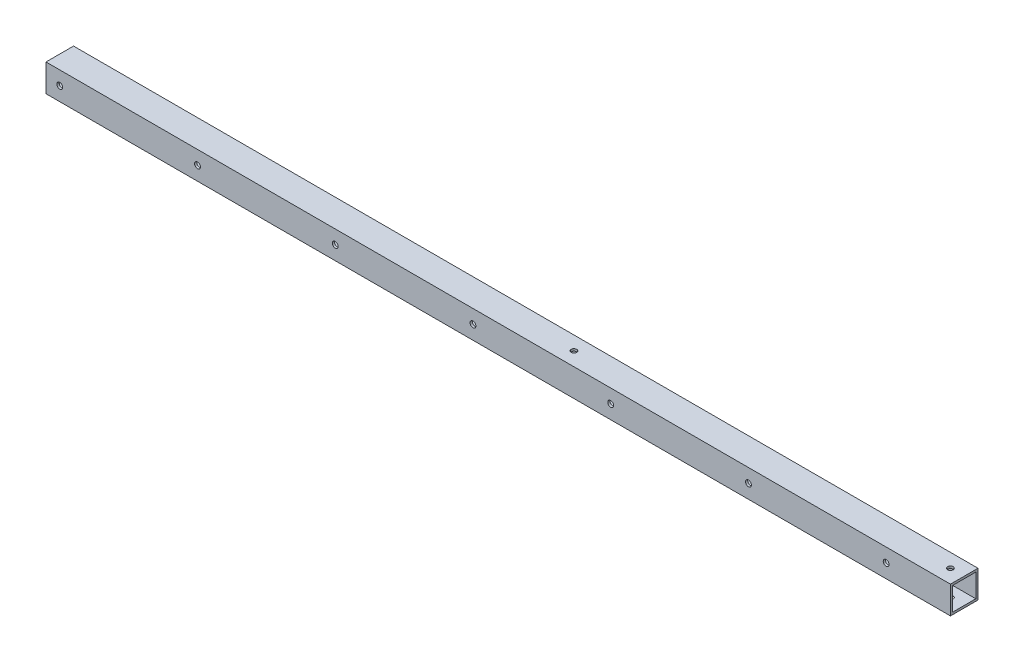
ISO-10303-21;
HEADER;
FILE_DESCRIPTION(('STEP AP214'),'2;1');
FILE_NAME('part.step','',(''),(''),'','','');
FILE_SCHEMA(('AUTOMOTIVE_DESIGN { 1 0 10303 214 1 1 1 1 }'));
ENDSEC;
DATA;
#1=APPLICATION_CONTEXT('core data for automotive mechanical design processes');
#2=APPLICATION_PROTOCOL_DEFINITION('international standard','automotive_design',2000,#1);
#3=PRODUCT_CONTEXT('',#1,'mechanical');
#4=PRODUCT('Part','Part','',(#3));
#5=PRODUCT_RELATED_PRODUCT_CATEGORY('part','',(#4));
#6=PRODUCT_DEFINITION_FORMATION('','',#4);
#7=PRODUCT_DEFINITION_CONTEXT('part definition',#1,'design');
#8=PRODUCT_DEFINITION('design','',#6,#7);
#9=PRODUCT_DEFINITION_SHAPE('','',#8);
#10=(LENGTH_UNIT() NAMED_UNIT(*) SI_UNIT(.MILLI.,.METRE.));
#11=(NAMED_UNIT(*) PLANE_ANGLE_UNIT() SI_UNIT($,.RADIAN.));
#12=(NAMED_UNIT(*) SI_UNIT($,.STERADIAN.) SOLID_ANGLE_UNIT());
#13=UNCERTAINTY_MEASURE_WITH_UNIT(LENGTH_MEASURE(1.E-05),#10,'distance_accuracy_value','');
#14=(GEOMETRIC_REPRESENTATION_CONTEXT(3) GLOBAL_UNCERTAINTY_ASSIGNED_CONTEXT((#13)) GLOBAL_UNIT_ASSIGNED_CONTEXT((#10,
#11,#12)) REPRESENTATION_CONTEXT('',''));
#15=CARTESIAN_POINT('',(0.,0.,0.));
#16=DIRECTION('',(0.,0.,1.));
#17=DIRECTION('',(1.,0.,0.));
#18=AXIS2_PLACEMENT_3D('',#15,#16,#17);
#19=CARTESIAN_POINT('',(7.5,7.49999999999998,15.));
#20=DIRECTION('',(0.,0.,-1.));
#21=DIRECTION('',(-1.,0.,0.));
#22=AXIS2_PLACEMENT_3D('',#19,#20,#21);
#23=CYLINDRICAL_SURFACE('',#22,1.6);
#24=CARTESIAN_POINT('',(7.5,7.49999999999998,13.8));
#25=DIRECTION('',(0.,0.,1.));
#26=DIRECTION('',(1.,0.,0.));
#27=AXIS2_PLACEMENT_3D('',#24,#25,#26);
#28=CIRCLE('',#27,1.6);
#29=CARTESIAN_POINT('',(9.1,7.49999999999998,13.8));
#30=VERTEX_POINT('',#29);
#31=EDGE_CURVE('E211',#30,#30,#28,.T.);
#32=ORIENTED_EDGE('',*,*,#31,.F.);
#33=EDGE_LOOP('',(#32));
#34=FACE_BOUND('',#33,.T.);
#35=CARTESIAN_POINT('',(7.5,7.49999999999998,15.));
#36=DIRECTION('',(0.,0.,1.));
#37=DIRECTION('',(1.,0.,0.));
#38=AXIS2_PLACEMENT_3D('',#35,#36,#37);
#39=CIRCLE('',#38,1.6);
#40=CARTESIAN_POINT('',(9.1,7.49999999999998,15.));
#41=VERTEX_POINT('',#40);
#42=EDGE_CURVE('E264',#41,#41,#39,.T.);
#43=ORIENTED_EDGE('',*,*,#42,.T.);
#44=EDGE_LOOP('',(#43));
#45=FACE_BOUND('',#44,.T.);
#46=ADVANCED_FACE('F47',(#34,#45),#23,.F.);
#47=CARTESIAN_POINT('',(457.5,7.50000000000002,15.));
#48=DIRECTION('',(0.,0.,-1.));
#49=DIRECTION('',(-1.,0.,0.));
#50=AXIS2_PLACEMENT_3D('',#47,#48,#49);
#51=CYLINDRICAL_SURFACE('',#50,1.59999999999996);
#52=CARTESIAN_POINT('',(457.5,7.50000000000002,13.8));
#53=DIRECTION('',(0.,0.,1.));
#54=DIRECTION('',(1.,0.,0.));
#55=AXIS2_PLACEMENT_3D('',#52,#53,#54);
#56=CIRCLE('',#55,1.59999999999996);
#57=CARTESIAN_POINT('',(459.1,7.50000000000002,13.8));
#58=VERTEX_POINT('',#57);
#59=EDGE_CURVE('E207',#58,#58,#56,.T.);
#60=ORIENTED_EDGE('',*,*,#59,.F.);
#61=EDGE_LOOP('',(#60));
#62=FACE_BOUND('',#61,.T.);
#63=CARTESIAN_POINT('',(457.5,7.50000000000002,15.));
#64=DIRECTION('',(0.,0.,1.));
#65=DIRECTION('',(1.,0.,0.));
#66=AXIS2_PLACEMENT_3D('',#63,#64,#65);
#67=CIRCLE('',#66,1.59999999999996);
#68=CARTESIAN_POINT('',(459.1,7.50000000000002,15.));
#69=VERTEX_POINT('',#68);
#70=EDGE_CURVE('E256',#69,#69,#67,.T.);
#71=ORIENTED_EDGE('',*,*,#70,.T.);
#72=EDGE_LOOP('',(#71));
#73=FACE_BOUND('',#72,.T.);
#74=ADVANCED_FACE('F410',(#62,#73),#51,.F.);
#75=CARTESIAN_POINT('',(232.5,7.50000000000001,15.));
#76=DIRECTION('',(0.,0.,-1.));
#77=DIRECTION('',(-1.,0.,0.));
#78=AXIS2_PLACEMENT_3D('',#75,#76,#77);
#79=CYLINDRICAL_SURFACE('',#78,1.59999999999999);
#80=CARTESIAN_POINT('',(232.5,7.50000000000001,13.8));
#81=DIRECTION('',(0.,0.,1.));
#82=DIRECTION('',(1.,0.,0.));
#83=AXIS2_PLACEMENT_3D('',#80,#81,#82);
#84=CIRCLE('',#83,1.59999999999999);
#85=CARTESIAN_POINT('',(234.1,7.50000000000001,13.8));
#86=VERTEX_POINT('',#85);
#87=EDGE_CURVE('E203',#86,#86,#84,.T.);
#88=ORIENTED_EDGE('',*,*,#87,.F.);
#89=EDGE_LOOP('',(#88));
#90=FACE_BOUND('',#89,.T.);
#91=CARTESIAN_POINT('',(232.5,7.50000000000001,15.));
#92=DIRECTION('',(0.,0.,1.));
#93=DIRECTION('',(1.,0.,0.));
#94=AXIS2_PLACEMENT_3D('',#91,#92,#93);
#95=CIRCLE('',#94,1.59999999999999);
#96=CARTESIAN_POINT('',(234.1,7.50000000000001,15.));
#97=VERTEX_POINT('',#96);
#98=EDGE_CURVE('E248',#97,#97,#95,.T.);
#99=ORIENTED_EDGE('',*,*,#98,.T.);
#100=EDGE_LOOP('',(#99));
#101=FACE_BOUND('',#100,.T.);
#102=ADVANCED_FACE('F418',(#90,#101),#79,.F.);
#103=CARTESIAN_POINT('',(307.5,7.50000000000002,15.));
#104=DIRECTION('',(0.,0.,-1.));
#105=DIRECTION('',(-1.,0.,0.));
#106=AXIS2_PLACEMENT_3D('',#103,#104,#105);
#107=CYLINDRICAL_SURFACE('',#106,1.59999999999996);
#108=CARTESIAN_POINT('',(307.5,7.50000000000002,13.8));
#109=DIRECTION('',(0.,0.,1.));
#110=DIRECTION('',(1.,0.,0.));
#111=AXIS2_PLACEMENT_3D('',#108,#109,#110);
#112=CIRCLE('',#111,1.59999999999996);
#113=CARTESIAN_POINT('',(309.1,7.50000000000002,13.8));
#114=VERTEX_POINT('',#113);
#115=EDGE_CURVE('E199',#114,#114,#112,.T.);
#116=ORIENTED_EDGE('',*,*,#115,.F.);
#117=EDGE_LOOP('',(#116));
#118=FACE_BOUND('',#117,.T.);
#119=CARTESIAN_POINT('',(307.5,7.50000000000002,15.));
#120=DIRECTION('',(0.,0.,1.));
#121=DIRECTION('',(1.,0.,0.));
#122=AXIS2_PLACEMENT_3D('',#119,#120,#121);
#123=CIRCLE('',#122,1.59999999999996);
#124=CARTESIAN_POINT('',(309.1,7.50000000000002,15.));
#125=VERTEX_POINT('',#124);
#126=EDGE_CURVE('E240',#125,#125,#123,.T.);
#127=ORIENTED_EDGE('',*,*,#126,.T.);
#128=EDGE_LOOP('',(#127));
#129=FACE_BOUND('',#128,.T.);
#130=ADVANCED_FACE('F460',(#118,#129),#107,.F.);
#131=CARTESIAN_POINT('',(82.5,7.49999999999999,15.));
#132=DIRECTION('',(0.,0.,-1.));
#133=DIRECTION('',(-1.,0.,0.));
#134=AXIS2_PLACEMENT_3D('',#131,#132,#133);
#135=CYLINDRICAL_SURFACE('',#134,1.6);
#136=CARTESIAN_POINT('',(82.5,7.49999999999999,13.8));
#137=DIRECTION('',(0.,0.,1.));
#138=DIRECTION('',(1.,0.,0.));
#139=AXIS2_PLACEMENT_3D('',#136,#137,#138);
#140=CIRCLE('',#139,1.6);
#141=CARTESIAN_POINT('',(84.1,7.49999999999999,13.8));
#142=VERTEX_POINT('',#141);
#143=EDGE_CURVE('E195',#142,#142,#140,.T.);
#144=ORIENTED_EDGE('',*,*,#143,.F.);
#145=EDGE_LOOP('',(#144));
#146=FACE_BOUND('',#145,.T.);
#147=CARTESIAN_POINT('',(82.5,7.49999999999999,15.));
#148=DIRECTION('',(0.,0.,1.));
#149=DIRECTION('',(1.,0.,0.));
#150=AXIS2_PLACEMENT_3D('',#147,#148,#149);
#151=CIRCLE('',#150,1.6);
#152=CARTESIAN_POINT('',(84.1,7.49999999999999,15.));
#153=VERTEX_POINT('',#152);
#154=EDGE_CURVE('E232',#153,#153,#151,.T.);
#155=ORIENTED_EDGE('',*,*,#154,.T.);
#156=EDGE_LOOP('',(#155));
#157=FACE_BOUND('',#156,.T.);
#158=ADVANCED_FACE('F401',(#146,#157),#135,.F.);
#159=CARTESIAN_POINT('',(157.5,7.5,15.));
#160=DIRECTION('',(0.,0.,-1.));
#161=DIRECTION('',(-1.,0.,0.));
#162=AXIS2_PLACEMENT_3D('',#159,#160,#161);
#163=CYLINDRICAL_SURFACE('',#162,1.59999999999999);
#164=CARTESIAN_POINT('',(157.5,7.5,13.8));
#165=DIRECTION('',(0.,0.,1.));
#166=DIRECTION('',(1.,0.,0.));
#167=AXIS2_PLACEMENT_3D('',#164,#165,#166);
#168=CIRCLE('',#167,1.59999999999999);
#169=CARTESIAN_POINT('',(159.1,7.5,13.8));
#170=VERTEX_POINT('',#169);
#171=EDGE_CURVE('E191',#170,#170,#168,.T.);
#172=ORIENTED_EDGE('',*,*,#171,.F.);
#173=EDGE_LOOP('',(#172));
#174=FACE_BOUND('',#173,.T.);
#175=CARTESIAN_POINT('',(157.5,7.5,15.));
#176=DIRECTION('',(0.,0.,1.));
#177=DIRECTION('',(1.,0.,0.));
#178=AXIS2_PLACEMENT_3D('',#175,#176,#177);
#179=CIRCLE('',#178,1.59999999999999);
#180=CARTESIAN_POINT('',(159.1,7.5,15.));
#181=VERTEX_POINT('',#180);
#182=EDGE_CURVE('E224',#181,#181,#179,.T.);
#183=ORIENTED_EDGE('',*,*,#182,.T.);
#184=EDGE_LOOP('',(#183));
#185=FACE_BOUND('',#184,.T.);
#186=ADVANCED_FACE('F393',(#174,#185),#163,.F.);
#187=CARTESIAN_POINT('',(382.5,7.50000000000002,15.));
#188=DIRECTION('',(0.,0.,-1.));
#189=DIRECTION('',(-1.,0.,0.));
#190=AXIS2_PLACEMENT_3D('',#187,#188,#189);
#191=CYLINDRICAL_SURFACE('',#190,1.59999999999996);
#192=CARTESIAN_POINT('',(382.5,7.50000000000002,13.8));
#193=DIRECTION('',(0.,0.,1.));
#194=DIRECTION('',(1.,0.,0.));
#195=AXIS2_PLACEMENT_3D('',#192,#193,#194);
#196=CIRCLE('',#195,1.59999999999996);
#197=CARTESIAN_POINT('',(384.1,7.50000000000002,13.8));
#198=VERTEX_POINT('',#197);
#199=EDGE_CURVE('E190',#198,#198,#196,.T.);
#200=ORIENTED_EDGE('',*,*,#199,.F.);
#201=EDGE_LOOP('',(#200));
#202=FACE_BOUND('',#201,.T.);
#203=CARTESIAN_POINT('',(382.5,7.50000000000002,15.));
#204=DIRECTION('',(0.,0.,1.));
#205=DIRECTION('',(1.,0.,0.));
#206=AXIS2_PLACEMENT_3D('',#203,#204,#205);
#207=CIRCLE('',#206,1.59999999999996);
#208=CARTESIAN_POINT('',(384.1,7.50000000000002,15.));
#209=VERTEX_POINT('',#208);
#210=EDGE_CURVE('E216',#209,#209,#207,.T.);
#211=ORIENTED_EDGE('',*,*,#210,.T.);
#212=EDGE_LOOP('',(#211));
#213=FACE_BOUND('',#212,.T.);
#214=ADVANCED_FACE('F376',(#202,#213),#191,.F.);
#215=CARTESIAN_POINT('',(0.,0.,15.));
#216=DIRECTION('',(0.,0.,-1.));
#217=DIRECTION('',(-1.,0.,0.));
#218=AXIS2_PLACEMENT_3D('',#215,#216,#217);
#219=PLANE('',#218);
#220=DIRECTION('',(0.,-1.,0.));
#221=VECTOR('',#220,1.);
#222=CARTESIAN_POINT('',(0.,0.,15.));
#223=LINE('',#222,#221);
#224=CARTESIAN_POINT('',(0.,15.,15.));
#225=VERTEX_POINT('',#224);
#226=CARTESIAN_POINT('',(0.,0.,15.));
#227=VERTEX_POINT('',#226);
#228=EDGE_CURVE('E272',#225,#227,#223,.T.);
#229=ORIENTED_EDGE('',*,*,#228,.T.);
#230=DIRECTION('',(1.,0.,0.));
#231=VECTOR('',#230,1.);
#232=CARTESIAN_POINT('',(0.,0.,15.));
#233=LINE('',#232,#231);
#234=CARTESIAN_POINT('',(492.5,0.,15.));
#235=VERTEX_POINT('',#234);
#236=EDGE_CURVE('E276',#227,#235,#233,.T.);
#237=ORIENTED_EDGE('',*,*,#236,.T.);
#238=DIRECTION('',(0.,1.,0.));
#239=VECTOR('',#238,1.);
#240=CARTESIAN_POINT('',(492.5,0.,15.));
#241=LINE('',#240,#239);
#242=CARTESIAN_POINT('',(492.5,15.,15.));
#243=VERTEX_POINT('',#242);
#244=EDGE_CURVE('E280',#235,#243,#241,.T.);
#245=ORIENTED_EDGE('',*,*,#244,.T.);
#246=DIRECTION('',(-1.,0.,0.));
#247=VECTOR('',#246,1.);
#248=CARTESIAN_POINT('',(0.,15.,15.));
#249=LINE('',#248,#247);
#250=EDGE_CURVE('E283',#243,#225,#249,.T.);
#251=ORIENTED_EDGE('',*,*,#250,.T.);
#252=EDGE_LOOP('',(#229,#237,#245,#251));
#253=FACE_BOUND('',#252,.T.);
#254=ORIENTED_EDGE('',*,*,#42,.F.);
#255=EDGE_LOOP('',(#254));
#256=FACE_BOUND('',#255,.T.);
#257=ORIENTED_EDGE('',*,*,#70,.F.);
#258=EDGE_LOOP('',(#257));
#259=FACE_BOUND('',#258,.T.);
#260=ORIENTED_EDGE('',*,*,#98,.F.);
#261=EDGE_LOOP('',(#260));
#262=FACE_BOUND('',#261,.T.);
#263=ORIENTED_EDGE('',*,*,#126,.F.);
#264=EDGE_LOOP('',(#263));
#265=FACE_BOUND('',#264,.T.);
#266=ORIENTED_EDGE('',*,*,#154,.F.);
#267=EDGE_LOOP('',(#266));
#268=FACE_BOUND('',#267,.T.);
#269=ORIENTED_EDGE('',*,*,#182,.F.);
#270=EDGE_LOOP('',(#269));
#271=FACE_BOUND('',#270,.T.);
#272=ORIENTED_EDGE('',*,*,#210,.F.);
#273=EDGE_LOOP('',(#272));
#274=FACE_BOUND('',#273,.T.);
#275=ADVANCED_FACE('F373',(#253,#256,#259,#262,#265,#268,#271,#274),#219,.F.);
#276=CARTESIAN_POINT('',(0.,0.,0.));
#277=DIRECTION('',(0.,0.,-1.));
#278=DIRECTION('',(-1.,0.,0.));
#279=AXIS2_PLACEMENT_3D('',#276,#277,#278);
#280=PLANE('',#279);
#281=CARTESIAN_POINT('',(157.5,7.5,0.));
#282=DIRECTION('',(0.,0.,1.));
#283=DIRECTION('',(1.,0.,0.));
#284=AXIS2_PLACEMENT_3D('',#281,#282,#283);
#285=CIRCLE('',#284,1.59999999999999);
#286=CARTESIAN_POINT('',(159.1,7.5,0.));
#287=VERTEX_POINT('',#286);
#288=EDGE_CURVE('E220',#287,#287,#285,.T.);
#289=ORIENTED_EDGE('',*,*,#288,.T.);
#290=EDGE_LOOP('',(#289));
#291=FACE_BOUND('',#290,.T.);
#292=CARTESIAN_POINT('',(307.5,7.50000000000002,0.));
#293=DIRECTION('',(0.,0.,1.));
#294=DIRECTION('',(1.,0.,0.));
#295=AXIS2_PLACEMENT_3D('',#292,#293,#294);
#296=CIRCLE('',#295,1.59999999999996);
#297=CARTESIAN_POINT('',(309.1,7.50000000000002,0.));
#298=VERTEX_POINT('',#297);
#299=EDGE_CURVE('E236',#298,#298,#296,.T.);
#300=ORIENTED_EDGE('',*,*,#299,.T.);
#301=EDGE_LOOP('',(#300));
#302=FACE_BOUND('',#301,.T.);
#303=CARTESIAN_POINT('',(457.5,7.50000000000002,0.));
#304=DIRECTION('',(0.,0.,1.));
#305=DIRECTION('',(1.,0.,0.));
#306=AXIS2_PLACEMENT_3D('',#303,#304,#305);
#307=CIRCLE('',#306,1.59999999999996);
#308=CARTESIAN_POINT('',(459.1,7.50000000000002,0.));
#309=VERTEX_POINT('',#308);
#310=EDGE_CURVE('E252',#309,#309,#307,.T.);
#311=ORIENTED_EDGE('',*,*,#310,.T.);
#312=EDGE_LOOP('',(#311));
#313=FACE_BOUND('',#312,.T.);
#314=DIRECTION('',(0.,-1.,0.));
#315=VECTOR('',#314,1.);
#316=CARTESIAN_POINT('',(0.,0.,0.));
#317=LINE('',#316,#315);
#318=CARTESIAN_POINT('',(0.,15.,0.));
#319=VERTEX_POINT('',#318);
#320=CARTESIAN_POINT('',(0.,0.,0.));
#321=VERTEX_POINT('',#320);
#322=EDGE_CURVE('E268',#319,#321,#317,.T.);
#323=ORIENTED_EDGE('',*,*,#322,.F.);
#324=DIRECTION('',(-1.,0.,0.));
#325=VECTOR('',#324,1.);
#326=CARTESIAN_POINT('',(0.,15.,0.));
#327=LINE('',#326,#325);
#328=CARTESIAN_POINT('',(492.5,15.,0.));
#329=VERTEX_POINT('',#328);
#330=EDGE_CURVE('E277',#329,#319,#327,.T.);
#331=ORIENTED_EDGE('',*,*,#330,.F.);
#332=DIRECTION('',(0.,1.,0.));
#333=VECTOR('',#332,1.);
#334=CARTESIAN_POINT('',(492.5,0.,0.));
#335=LINE('',#334,#333);
#336=CARTESIAN_POINT('',(492.5,0.,0.));
#337=VERTEX_POINT('',#336);
#338=EDGE_CURVE('E293',#337,#329,#335,.T.);
#339=ORIENTED_EDGE('',*,*,#338,.F.);
#340=DIRECTION('',(1.,0.,0.));
#341=VECTOR('',#340,1.);
#342=CARTESIAN_POINT('',(0.,0.,0.));
#343=LINE('',#342,#341);
#344=EDGE_CURVE('E290',#321,#337,#343,.T.);
#345=ORIENTED_EDGE('',*,*,#344,.F.);
#346=EDGE_LOOP('',(#323,#331,#339,#345));
#347=FACE_BOUND('',#346,.T.);
#348=CARTESIAN_POINT('',(7.5,7.49999999999998,0.));
#349=DIRECTION('',(0.,0.,1.));
#350=DIRECTION('',(1.,0.,0.));
#351=AXIS2_PLACEMENT_3D('',#348,#349,#350);
#352=CIRCLE('',#351,1.6);
#353=CARTESIAN_POINT('',(9.1,7.49999999999998,0.));
#354=VERTEX_POINT('',#353);
#355=EDGE_CURVE('E260',#354,#354,#352,.T.);
#356=ORIENTED_EDGE('',*,*,#355,.T.);
#357=EDGE_LOOP('',(#356));
#358=FACE_BOUND('',#357,.T.);
#359=CARTESIAN_POINT('',(232.5,7.50000000000001,0.));
#360=DIRECTION('',(0.,0.,1.));
#361=DIRECTION('',(1.,0.,0.));
#362=AXIS2_PLACEMENT_3D('',#359,#360,#361);
#363=CIRCLE('',#362,1.59999999999999);
#364=CARTESIAN_POINT('',(234.1,7.50000000000001,0.));
#365=VERTEX_POINT('',#364);
#366=EDGE_CURVE('E244',#365,#365,#363,.T.);
#367=ORIENTED_EDGE('',*,*,#366,.T.);
#368=EDGE_LOOP('',(#367));
#369=FACE_BOUND('',#368,.T.);
#370=CARTESIAN_POINT('',(82.5,7.49999999999999,0.));
#371=DIRECTION('',(0.,0.,1.));
#372=DIRECTION('',(1.,0.,0.));
#373=AXIS2_PLACEMENT_3D('',#370,#371,#372);
#374=CIRCLE('',#373,1.6);
#375=CARTESIAN_POINT('',(84.1,7.49999999999999,0.));
#376=VERTEX_POINT('',#375);
#377=EDGE_CURVE('E228',#376,#376,#374,.T.);
#378=ORIENTED_EDGE('',*,*,#377,.T.);
#379=EDGE_LOOP('',(#378));
#380=FACE_BOUND('',#379,.T.);
#381=CARTESIAN_POINT('',(382.5,7.50000000000002,0.));
#382=DIRECTION('',(0.,0.,1.));
#383=DIRECTION('',(1.,0.,0.));
#384=AXIS2_PLACEMENT_3D('',#381,#382,#383);
#385=CIRCLE('',#384,1.59999999999996);
#386=CARTESIAN_POINT('',(384.1,7.50000000000002,0.));
#387=VERTEX_POINT('',#386);
#388=EDGE_CURVE('E215',#387,#387,#385,.T.);
#389=ORIENTED_EDGE('',*,*,#388,.T.);
#390=EDGE_LOOP('',(#389));
#391=FACE_BOUND('',#390,.T.);
#392=ADVANCED_FACE('F365',(#291,#302,#313,#347,#358,#369,#380,#391),#280,.T.);
#393=CARTESIAN_POINT('',(0.,0.,15.));
#394=DIRECTION('',(1.,0.,0.));
#395=DIRECTION('',(0.,0.,-1.));
#396=AXIS2_PLACEMENT_3D('',#393,#394,#395);
#397=PLANE('',#396);
#398=DIRECTION('',(0.,-1.,0.));
#399=VECTOR('',#398,1.);
#400=CARTESIAN_POINT('',(0.,13.8,13.8));
#401=LINE('',#400,#399);
#402=CARTESIAN_POINT('',(0.,13.8,13.8));
#403=VERTEX_POINT('',#402);
#404=CARTESIAN_POINT('',(0.,1.2,13.8));
#405=VERTEX_POINT('',#404);
#406=EDGE_CURVE('E123',#403,#405,#401,.T.);
#407=ORIENTED_EDGE('',*,*,#406,.T.);
#408=DIRECTION('',(0.,0.,-1.));
#409=VECTOR('',#408,1.);
#410=CARTESIAN_POINT('',(0.,1.2,13.8));
#411=LINE('',#410,#409);
#412=CARTESIAN_POINT('',(0.,1.2,1.2));
#413=VERTEX_POINT('',#412);
#414=EDGE_CURVE('E116',#405,#413,#411,.T.);
#415=ORIENTED_EDGE('',*,*,#414,.T.);
#416=DIRECTION('',(0.,1.,0.));
#417=VECTOR('',#416,1.);
#418=CARTESIAN_POINT('',(0.,1.2,1.2));
#419=LINE('',#418,#417);
#420=CARTESIAN_POINT('',(0.,13.8,1.2));
#421=VERTEX_POINT('',#420);
#422=EDGE_CURVE('E126',#413,#421,#419,.T.);
#423=ORIENTED_EDGE('',*,*,#422,.T.);
#424=DIRECTION('',(0.,0.,1.));
#425=VECTOR('',#424,1.);
#426=CARTESIAN_POINT('',(0.,13.8,1.2));
#427=LINE('',#426,#425);
#428=EDGE_CURVE('E64',#421,#403,#427,.T.);
#429=ORIENTED_EDGE('',*,*,#428,.T.);
#430=EDGE_LOOP('',(#407,#415,#423,#429));
#431=FACE_BOUND('',#430,.T.);
#432=ORIENTED_EDGE('',*,*,#322,.T.);
#433=DIRECTION('',(0.,0.,-1.));
#434=VECTOR('',#433,1.);
#435=CARTESIAN_POINT('',(0.,0.,15.));
#436=LINE('',#435,#434);
#437=EDGE_CURVE('E309',#227,#321,#436,.T.);
#438=ORIENTED_EDGE('',*,*,#437,.F.);
#439=ORIENTED_EDGE('',*,*,#228,.F.);
#440=DIRECTION('',(0.,0.,-1.));
#441=VECTOR('',#440,1.);
#442=CARTESIAN_POINT('',(0.,15.,15.));
#443=LINE('',#442,#441);
#444=EDGE_CURVE('E286',#225,#319,#443,.T.);
#445=ORIENTED_EDGE('',*,*,#444,.T.);
#446=EDGE_LOOP('',(#432,#438,#439,#445));
#447=FACE_BOUND('',#446,.T.);
#448=ADVANCED_FACE('F131',(#431,#447),#397,.F.);
#449=CARTESIAN_POINT('',(0.,0.,15.));
#450=DIRECTION('',(0.,1.,0.));
#451=DIRECTION('',(0.,0.,1.));
#452=AXIS2_PLACEMENT_3D('',#449,#450,#451);
#453=PLANE('',#452);
#454=CARTESIAN_POINT('',(485.,0.,7.5));
#455=DIRECTION('',(0.,1.,0.));
#456=DIRECTION('',(0.,0.,1.));
#457=AXIS2_PLACEMENT_3D('',#454,#455,#456);
#458=CIRCLE('',#457,2.50000000000006);
#459=CARTESIAN_POINT('',(485.,0.,10.0000000000001));
#460=VERTEX_POINT('',#459);
#461=EDGE_CURVE('E333',#460,#460,#458,.T.);
#462=ORIENTED_EDGE('',*,*,#461,.T.);
#463=EDGE_LOOP('',(#462));
#464=FACE_BOUND('',#463,.T.);
#465=CARTESIAN_POINT('',(280.,0.,7.50000000000002));
#466=DIRECTION('',(0.,1.,0.));
#467=DIRECTION('',(0.,0.,1.));
#468=AXIS2_PLACEMENT_3D('',#465,#466,#467);
#469=CIRCLE('',#468,2.49999999999995);
#470=CARTESIAN_POINT('',(280.,0.,9.99999999999997));
#471=VERTEX_POINT('',#470);
#472=EDGE_CURVE('E313',#471,#471,#469,.T.);
#473=ORIENTED_EDGE('',*,*,#472,.T.);
#474=EDGE_LOOP('',(#473));
#475=FACE_BOUND('',#474,.T.);
#476=ORIENTED_EDGE('',*,*,#344,.T.);
#477=DIRECTION('',(0.,0.,-1.));
#478=VECTOR('',#477,1.);
#479=CARTESIAN_POINT('',(492.5,0.,15.));
#480=LINE('',#479,#478);
#481=EDGE_CURVE('E305',#235,#337,#480,.T.);
#482=ORIENTED_EDGE('',*,*,#481,.F.);
#483=ORIENTED_EDGE('',*,*,#236,.F.);
#484=ORIENTED_EDGE('',*,*,#437,.T.);
#485=EDGE_LOOP('',(#476,#482,#483,#484));
#486=FACE_BOUND('',#485,.T.);
#487=ADVANCED_FACE('F349',(#464,#475,#486),#453,.F.);
#488=CARTESIAN_POINT('',(492.5,0.,15.));
#489=DIRECTION('',(-1.,0.,0.));
#490=DIRECTION('',(0.,0.,1.));
#491=AXIS2_PLACEMENT_3D('',#488,#489,#490);
#492=PLANE('',#491);
#493=DIRECTION('',(0.,1.,0.));
#494=VECTOR('',#493,1.);
#495=CARTESIAN_POINT('',(492.5,1.2,1.2));
#496=LINE('',#495,#494);
#497=CARTESIAN_POINT('',(492.5,1.2,1.2));
#498=VERTEX_POINT('',#497);
#499=CARTESIAN_POINT('',(492.5,13.8,1.2));
#500=VERTEX_POINT('',#499);
#501=EDGE_CURVE('E151',#498,#500,#496,.T.);
#502=ORIENTED_EDGE('',*,*,#501,.F.);
#503=DIRECTION('',(0.,0.,-1.));
#504=VECTOR('',#503,1.);
#505=CARTESIAN_POINT('',(492.5,1.2,13.8));
#506=LINE('',#505,#504);
#507=CARTESIAN_POINT('',(492.5,1.2,13.8));
#508=VERTEX_POINT('',#507);
#509=EDGE_CURVE('E72',#508,#498,#506,.T.);
#510=ORIENTED_EDGE('',*,*,#509,.F.);
#511=DIRECTION('',(0.,-1.,0.));
#512=VECTOR('',#511,1.);
#513=CARTESIAN_POINT('',(492.5,13.8,13.8));
#514=LINE('',#513,#512);
#515=CARTESIAN_POINT('',(492.5,13.8,13.8));
#516=VERTEX_POINT('',#515);
#517=EDGE_CURVE('E135',#516,#508,#514,.T.);
#518=ORIENTED_EDGE('',*,*,#517,.F.);
#519=DIRECTION('',(0.,0.,1.));
#520=VECTOR('',#519,1.);
#521=CARTESIAN_POINT('',(492.5,13.8,1.2));
#522=LINE('',#521,#520);
#523=EDGE_CURVE('E139',#500,#516,#522,.T.);
#524=ORIENTED_EDGE('',*,*,#523,.F.);
#525=EDGE_LOOP('',(#502,#510,#518,#524));
#526=FACE_BOUND('',#525,.T.);
#527=ORIENTED_EDGE('',*,*,#338,.T.);
#528=DIRECTION('',(0.,0.,-1.));
#529=VECTOR('',#528,1.);
#530=CARTESIAN_POINT('',(492.5,15.,15.));
#531=LINE('',#530,#529);
#532=EDGE_CURVE('E301',#243,#329,#531,.T.);
#533=ORIENTED_EDGE('',*,*,#532,.F.);
#534=ORIENTED_EDGE('',*,*,#244,.F.);
#535=ORIENTED_EDGE('',*,*,#481,.T.);
#536=EDGE_LOOP('',(#527,#533,#534,#535));
#537=FACE_BOUND('',#536,.T.);
#538=ADVANCED_FACE('F352',(#526,#537),#492,.F.);
#539=CARTESIAN_POINT('',(0.,15.,15.));
#540=DIRECTION('',(0.,-1.,0.));
#541=DIRECTION('',(1.,0.,0.));
#542=AXIS2_PLACEMENT_3D('',#539,#540,#541);
#543=PLANE('',#542);
#544=CARTESIAN_POINT('',(280.,15.,7.50000000000002));
#545=DIRECTION('',(0.,1.,0.));
#546=DIRECTION('',(-1.,0.,0.));
#547=AXIS2_PLACEMENT_3D('',#544,#545,#546);
#548=CIRCLE('',#547,1.50000000000002);
#549=CARTESIAN_POINT('',(278.5,15.,7.50000000000002));
#550=VERTEX_POINT('',#549);
#551=EDGE_CURVE('E325',#550,#550,#548,.T.);
#552=ORIENTED_EDGE('',*,*,#551,.F.);
#553=EDGE_LOOP('',(#552));
#554=FACE_BOUND('',#553,.T.);
#555=CARTESIAN_POINT('',(485.,15.,7.5));
#556=DIRECTION('',(0.,1.,0.));
#557=DIRECTION('',(-1.,0.,0.));
#558=AXIS2_PLACEMENT_3D('',#555,#556,#557);
#559=CIRCLE('',#558,1.50000000000008);
#560=CARTESIAN_POINT('',(483.5,15.,7.5));
#561=VERTEX_POINT('',#560);
#562=EDGE_CURVE('E506',#561,#561,#559,.T.);
#563=ORIENTED_EDGE('',*,*,#562,.F.);
#564=EDGE_LOOP('',(#563));
#565=FACE_BOUND('',#564,.T.);
#566=ORIENTED_EDGE('',*,*,#330,.T.);
#567=ORIENTED_EDGE('',*,*,#444,.F.);
#568=ORIENTED_EDGE('',*,*,#250,.F.);
#569=ORIENTED_EDGE('',*,*,#532,.T.);
#570=EDGE_LOOP('',(#566,#567,#568,#569));
#571=FACE_BOUND('',#570,.T.);
#572=ADVANCED_FACE('F369',(#554,#565,#571),#543,.F.);
#573=CARTESIAN_POINT('',(7.5,7.49999999999998,1.2));
#574=DIRECTION('',(0.,0.,-1.));
#575=DIRECTION('',(-1.,0.,0.));
#576=AXIS2_PLACEMENT_3D('',#573,#574,#575);
#577=CIRCLE('',#576,1.6);
#578=CARTESIAN_POINT('',(5.9,7.49999999999998,1.2));
#579=VERTEX_POINT('',#578);
#580=EDGE_CURVE('E186',#579,#579,#577,.T.);
#581=ORIENTED_EDGE('',*,*,#580,.F.);
#582=EDGE_LOOP('',(#581));
#583=FACE_BOUND('',#582,.T.);
#584=ORIENTED_EDGE('',*,*,#355,.F.);
#585=EDGE_LOOP('',(#584));
#586=FACE_BOUND('',#585,.T.);
#587=ADVANCED_FACE('F413',(#583,#586),#23,.F.);
#588=CARTESIAN_POINT('',(457.5,7.50000000000002,1.2));
#589=DIRECTION('',(0.,0.,-1.));
#590=DIRECTION('',(-1.,0.,0.));
#591=AXIS2_PLACEMENT_3D('',#588,#589,#590);
#592=CIRCLE('',#591,1.59999999999996);
#593=CARTESIAN_POINT('',(455.9,7.50000000000002,1.2));
#594=VERTEX_POINT('',#593);
#595=EDGE_CURVE('E182',#594,#594,#592,.T.);
#596=ORIENTED_EDGE('',*,*,#595,.F.);
#597=EDGE_LOOP('',(#596));
#598=FACE_BOUND('',#597,.T.);
#599=ORIENTED_EDGE('',*,*,#310,.F.);
#600=EDGE_LOOP('',(#599));
#601=FACE_BOUND('',#600,.T.);
#602=ADVANCED_FACE('F421',(#598,#601),#51,.F.);
#603=CARTESIAN_POINT('',(232.5,7.50000000000001,1.2));
#604=DIRECTION('',(0.,0.,-1.));
#605=DIRECTION('',(-1.,0.,0.));
#606=AXIS2_PLACEMENT_3D('',#603,#604,#605);
#607=CIRCLE('',#606,1.59999999999999);
#608=CARTESIAN_POINT('',(230.9,7.50000000000001,1.2));
#609=VERTEX_POINT('',#608);
#610=EDGE_CURVE('E178',#609,#609,#607,.T.);
#611=ORIENTED_EDGE('',*,*,#610,.F.);
#612=EDGE_LOOP('',(#611));
#613=FACE_BOUND('',#612,.T.);
#614=ORIENTED_EDGE('',*,*,#366,.F.);
#615=EDGE_LOOP('',(#614));
#616=FACE_BOUND('',#615,.T.);
#617=ADVANCED_FACE('F430',(#613,#616),#79,.F.);
#618=CARTESIAN_POINT('',(307.5,7.50000000000002,1.2));
#619=DIRECTION('',(0.,0.,-1.));
#620=DIRECTION('',(-1.,0.,0.));
#621=AXIS2_PLACEMENT_3D('',#618,#619,#620);
#622=CIRCLE('',#621,1.59999999999996);
#623=CARTESIAN_POINT('',(305.9,7.50000000000002,1.2));
#624=VERTEX_POINT('',#623);
#625=EDGE_CURVE('E174',#624,#624,#622,.T.);
#626=ORIENTED_EDGE('',*,*,#625,.F.);
#627=EDGE_LOOP('',(#626));
#628=FACE_BOUND('',#627,.T.);
#629=ORIENTED_EDGE('',*,*,#299,.F.);
#630=EDGE_LOOP('',(#629));
#631=FACE_BOUND('',#630,.T.);
#632=ADVANCED_FACE('F450',(#628,#631),#107,.F.);
#633=CARTESIAN_POINT('',(82.5,7.49999999999999,1.2));
#634=DIRECTION('',(0.,0.,-1.));
#635=DIRECTION('',(-1.,0.,0.));
#636=AXIS2_PLACEMENT_3D('',#633,#634,#635);
#637=CIRCLE('',#636,1.6);
#638=CARTESIAN_POINT('',(80.9,7.49999999999999,1.2));
#639=VERTEX_POINT('',#638);
#640=EDGE_CURVE('E170',#639,#639,#637,.T.);
#641=ORIENTED_EDGE('',*,*,#640,.F.);
#642=EDGE_LOOP('',(#641));
#643=FACE_BOUND('',#642,.T.);
#644=ORIENTED_EDGE('',*,*,#377,.F.);
#645=EDGE_LOOP('',(#644));
#646=FACE_BOUND('',#645,.T.);
#647=ADVANCED_FACE('F448',(#643,#646),#135,.F.);
#648=CARTESIAN_POINT('',(157.5,7.5,1.2));
#649=DIRECTION('',(0.,0.,-1.));
#650=DIRECTION('',(-1.,0.,0.));
#651=AXIS2_PLACEMENT_3D('',#648,#649,#650);
#652=CIRCLE('',#651,1.59999999999999);
#653=CARTESIAN_POINT('',(155.9,7.5,1.2));
#654=VERTEX_POINT('',#653);
#655=EDGE_CURVE('E166',#654,#654,#652,.T.);
#656=ORIENTED_EDGE('',*,*,#655,.F.);
#657=EDGE_LOOP('',(#656));
#658=FACE_BOUND('',#657,.T.);
#659=ORIENTED_EDGE('',*,*,#288,.F.);
#660=EDGE_LOOP('',(#659));
#661=FACE_BOUND('',#660,.T.);
#662=ADVANCED_FACE('F404',(#658,#661),#163,.F.);
#663=CARTESIAN_POINT('',(382.5,7.50000000000002,1.2));
#664=DIRECTION('',(0.,0.,-1.));
#665=DIRECTION('',(-1.,0.,0.));
#666=AXIS2_PLACEMENT_3D('',#663,#664,#665);
#667=CIRCLE('',#666,1.59999999999996);
#668=CARTESIAN_POINT('',(380.9,7.50000000000002,1.2));
#669=VERTEX_POINT('',#668);
#670=EDGE_CURVE('E160',#669,#669,#667,.T.);
#671=ORIENTED_EDGE('',*,*,#670,.F.);
#672=EDGE_LOOP('',(#671));
#673=FACE_BOUND('',#672,.T.);
#674=ORIENTED_EDGE('',*,*,#388,.F.);
#675=EDGE_LOOP('',(#674));
#676=FACE_BOUND('',#675,.T.);
#677=ADVANCED_FACE('F396',(#673,#676),#191,.F.);
#678=CARTESIAN_POINT('',(0.,1.2,13.8));
#679=DIRECTION('',(0.,-1.,0.));
#680=DIRECTION('',(0.,0.,-1.));
#681=AXIS2_PLACEMENT_3D('',#678,#679,#680);
#682=PLANE('',#681);
#683=CARTESIAN_POINT('',(280.,1.2,7.50000000000002));
#684=DIRECTION('',(0.,-1.,0.));
#685=DIRECTION('',(0.,0.,-1.));
#686=AXIS2_PLACEMENT_3D('',#683,#684,#685);
#687=CIRCLE('',#686,1.50000000000002);
#688=CARTESIAN_POINT('',(280.,1.2,6.));
#689=VERTEX_POINT('',#688);
#690=EDGE_CURVE('E142',#689,#689,#687,.T.);
#691=ORIENTED_EDGE('',*,*,#690,.T.);
#692=EDGE_LOOP('',(#691));
#693=FACE_BOUND('',#692,.T.);
#694=CARTESIAN_POINT('',(485.,1.2,7.5));
#695=DIRECTION('',(0.,-1.,0.));
#696=DIRECTION('',(0.,0.,-1.));
#697=AXIS2_PLACEMENT_3D('',#694,#695,#696);
#698=CIRCLE('',#697,1.50000000000008);
#699=CARTESIAN_POINT('',(485.,1.2,5.99999999999992));
#700=VERTEX_POINT('',#699);
#701=EDGE_CURVE('E324',#700,#700,#698,.T.);
#702=ORIENTED_EDGE('',*,*,#701,.T.);
#703=EDGE_LOOP('',(#702));
#704=FACE_BOUND('',#703,.T.);
#705=ORIENTED_EDGE('',*,*,#509,.T.);
#706=DIRECTION('',(1.,0.,0.));
#707=VECTOR('',#706,1.);
#708=CARTESIAN_POINT('',(0.,1.2,1.2));
#709=LINE('',#708,#707);
#710=EDGE_CURVE('E112',#413,#498,#709,.T.);
#711=ORIENTED_EDGE('',*,*,#710,.F.);
#712=ORIENTED_EDGE('',*,*,#414,.F.);
#713=DIRECTION('',(1.,0.,0.));
#714=VECTOR('',#713,1.);
#715=CARTESIAN_POINT('',(0.,1.2,13.8));
#716=LINE('',#715,#714);
#717=EDGE_CURVE('E157',#405,#508,#716,.T.);
#718=ORIENTED_EDGE('',*,*,#717,.T.);
#719=EDGE_LOOP('',(#705,#711,#712,#718));
#720=FACE_BOUND('',#719,.T.);
#721=ADVANCED_FACE('F114',(#693,#704,#720),#682,.F.);
#722=CARTESIAN_POINT('',(0.,13.8,13.8));
#723=DIRECTION('',(0.,0.,1.));
#724=DIRECTION('',(1.,0.,0.));
#725=AXIS2_PLACEMENT_3D('',#722,#723,#724);
#726=PLANE('',#725);
#727=ORIENTED_EDGE('',*,*,#31,.T.);
#728=EDGE_LOOP('',(#727));
#729=FACE_BOUND('',#728,.T.);
#730=ORIENTED_EDGE('',*,*,#59,.T.);
#731=EDGE_LOOP('',(#730));
#732=FACE_BOUND('',#731,.T.);
#733=ORIENTED_EDGE('',*,*,#87,.T.);
#734=EDGE_LOOP('',(#733));
#735=FACE_BOUND('',#734,.T.);
#736=ORIENTED_EDGE('',*,*,#115,.T.);
#737=EDGE_LOOP('',(#736));
#738=FACE_BOUND('',#737,.T.);
#739=ORIENTED_EDGE('',*,*,#143,.T.);
#740=EDGE_LOOP('',(#739));
#741=FACE_BOUND('',#740,.T.);
#742=ORIENTED_EDGE('',*,*,#171,.T.);
#743=EDGE_LOOP('',(#742));
#744=FACE_BOUND('',#743,.T.);
#745=ORIENTED_EDGE('',*,*,#199,.T.);
#746=EDGE_LOOP('',(#745));
#747=FACE_BOUND('',#746,.T.);
#748=ORIENTED_EDGE('',*,*,#517,.T.);
#749=ORIENTED_EDGE('',*,*,#717,.F.);
#750=ORIENTED_EDGE('',*,*,#406,.F.);
#751=DIRECTION('',(1.,0.,0.));
#752=VECTOR('',#751,1.);
#753=CARTESIAN_POINT('',(0.,13.8,13.8));
#754=LINE('',#753,#752);
#755=EDGE_CURVE('E161',#403,#516,#754,.T.);
#756=ORIENTED_EDGE('',*,*,#755,.T.);
#757=EDGE_LOOP('',(#748,#749,#750,#756));
#758=FACE_BOUND('',#757,.T.);
#759=ADVANCED_FACE('F471',(#729,#732,#735,#738,#741,#744,#747,#758),#726,.F.);
#760=CARTESIAN_POINT('',(0.,13.8,1.2));
#761=DIRECTION('',(0.,1.,0.));
#762=DIRECTION('',(0.,0.,1.));
#763=AXIS2_PLACEMENT_3D('',#760,#761,#762);
#764=PLANE('',#763);
#765=CARTESIAN_POINT('',(280.,13.8,7.50000000000002));
#766=DIRECTION('',(0.,1.,0.));
#767=DIRECTION('',(0.,0.,1.));
#768=AXIS2_PLACEMENT_3D('',#765,#766,#767);
#769=CIRCLE('',#768,1.50000000000002);
#770=CARTESIAN_POINT('',(280.,13.8,9.00000000000005));
#771=VERTEX_POINT('',#770);
#772=EDGE_CURVE('E326',#771,#771,#769,.T.);
#773=ORIENTED_EDGE('',*,*,#772,.T.);
#774=EDGE_LOOP('',(#773));
#775=FACE_BOUND('',#774,.T.);
#776=CARTESIAN_POINT('',(485.,13.8,7.5));
#777=DIRECTION('',(0.,1.,0.));
#778=DIRECTION('',(0.,0.,1.));
#779=AXIS2_PLACEMENT_3D('',#776,#777,#778);
#780=CIRCLE('',#779,1.50000000000008);
#781=CARTESIAN_POINT('',(485.,13.8,9.00000000000008));
#782=VERTEX_POINT('',#781);
#783=EDGE_CURVE('E320',#782,#782,#780,.T.);
#784=ORIENTED_EDGE('',*,*,#783,.T.);
#785=EDGE_LOOP('',(#784));
#786=FACE_BOUND('',#785,.T.);
#787=ORIENTED_EDGE('',*,*,#523,.T.);
#788=ORIENTED_EDGE('',*,*,#755,.F.);
#789=ORIENTED_EDGE('',*,*,#428,.F.);
#790=DIRECTION('',(1.,0.,0.));
#791=VECTOR('',#790,1.);
#792=CARTESIAN_POINT('',(0.,13.8,1.2));
#793=LINE('',#792,#791);
#794=EDGE_CURVE('E122',#421,#500,#793,.T.);
#795=ORIENTED_EDGE('',*,*,#794,.T.);
#796=EDGE_LOOP('',(#787,#788,#789,#795));
#797=FACE_BOUND('',#796,.T.);
#798=ADVANCED_FACE('F474',(#775,#786,#797),#764,.F.);
#799=CARTESIAN_POINT('',(0.,1.2,1.2));
#800=DIRECTION('',(0.,0.,-1.));
#801=DIRECTION('',(-1.,0.,0.));
#802=AXIS2_PLACEMENT_3D('',#799,#800,#801);
#803=PLANE('',#802);
#804=ORIENTED_EDGE('',*,*,#580,.T.);
#805=EDGE_LOOP('',(#804));
#806=FACE_BOUND('',#805,.T.);
#807=ORIENTED_EDGE('',*,*,#595,.T.);
#808=EDGE_LOOP('',(#807));
#809=FACE_BOUND('',#808,.T.);
#810=ORIENTED_EDGE('',*,*,#610,.T.);
#811=EDGE_LOOP('',(#810));
#812=FACE_BOUND('',#811,.T.);
#813=ORIENTED_EDGE('',*,*,#625,.T.);
#814=EDGE_LOOP('',(#813));
#815=FACE_BOUND('',#814,.T.);
#816=ORIENTED_EDGE('',*,*,#640,.T.);
#817=EDGE_LOOP('',(#816));
#818=FACE_BOUND('',#817,.T.);
#819=ORIENTED_EDGE('',*,*,#655,.T.);
#820=EDGE_LOOP('',(#819));
#821=FACE_BOUND('',#820,.T.);
#822=ORIENTED_EDGE('',*,*,#670,.T.);
#823=EDGE_LOOP('',(#822));
#824=FACE_BOUND('',#823,.T.);
#825=ORIENTED_EDGE('',*,*,#501,.T.);
#826=ORIENTED_EDGE('',*,*,#794,.F.);
#827=ORIENTED_EDGE('',*,*,#422,.F.);
#828=ORIENTED_EDGE('',*,*,#710,.T.);
#829=EDGE_LOOP('',(#825,#826,#827,#828));
#830=FACE_BOUND('',#829,.T.);
#831=ADVANCED_FACE('F127',(#806,#809,#812,#815,#818,#821,#824,#830),#803,.F.);
#832=CARTESIAN_POINT('',(485.,0.,7.5));
#833=DIRECTION('',(0.,1.,0.));
#834=DIRECTION('',(-1.,0.,0.));
#835=AXIS2_PLACEMENT_3D('',#832,#833,#834);
#836=CYLINDRICAL_SURFACE('',#835,1.50000000000008);
#837=ORIENTED_EDGE('',*,*,#562,.T.);
#838=EDGE_LOOP('',(#837));
#839=FACE_BOUND('',#838,.T.);
#840=ORIENTED_EDGE('',*,*,#783,.F.);
#841=EDGE_LOOP('',(#840));
#842=FACE_BOUND('',#841,.T.);
#843=ADVANCED_FACE('F491',(#839,#842),#836,.F.);
#844=CARTESIAN_POINT('',(280.,0.,7.50000000000002));
#845=DIRECTION('',(0.,1.,0.));
#846=DIRECTION('',(-1.,0.,0.));
#847=AXIS2_PLACEMENT_3D('',#844,#845,#846);
#848=CYLINDRICAL_SURFACE('',#847,1.50000000000002);
#849=ORIENTED_EDGE('',*,*,#551,.T.);
#850=EDGE_LOOP('',(#849));
#851=FACE_BOUND('',#850,.T.);
#852=ORIENTED_EDGE('',*,*,#772,.F.);
#853=EDGE_LOOP('',(#852));
#854=FACE_BOUND('',#853,.T.);
#855=ADVANCED_FACE('F514',(#851,#854),#848,.F.);
#856=CARTESIAN_POINT('',(485.,0.999999999999981,7.5));
#857=DIRECTION('',(0.,1.,0.));
#858=DIRECTION('',(0.,0.,1.));
#859=AXIS2_PLACEMENT_3D('',#856,#857,#858);
#860=CIRCLE('',#859,1.50000000000008);
#861=CARTESIAN_POINT('',(485.,0.999999999999981,9.00000000000008));
#862=VERTEX_POINT('',#861);
#863=EDGE_CURVE('E57',#862,#862,#860,.F.);
#864=ORIENTED_EDGE('',*,*,#863,.T.);
#865=EDGE_LOOP('',(#864));
#866=FACE_BOUND('',#865,.T.);
#867=ORIENTED_EDGE('',*,*,#701,.F.);
#868=EDGE_LOOP('',(#867));
#869=FACE_BOUND('',#868,.T.);
#870=ADVANCED_FACE('F340',(#866,#869),#836,.F.);
#871=CARTESIAN_POINT('',(280.,0.999999999999872,7.50000000000002));
#872=DIRECTION('',(0.,1.,0.));
#873=DIRECTION('',(0.,0.,1.));
#874=AXIS2_PLACEMENT_3D('',#871,#872,#873);
#875=CIRCLE('',#874,1.50000000000002);
#876=CARTESIAN_POINT('',(280.,0.999999999999872,9.00000000000005));
#877=VERTEX_POINT('',#876);
#878=EDGE_CURVE('E11',#877,#877,#875,.F.);
#879=ORIENTED_EDGE('',*,*,#878,.T.);
#880=EDGE_LOOP('',(#879));
#881=FACE_BOUND('',#880,.T.);
#882=ORIENTED_EDGE('',*,*,#690,.F.);
#883=EDGE_LOOP('',(#882));
#884=FACE_BOUND('',#883,.T.);
#885=ADVANCED_FACE('F346',(#881,#884),#848,.F.);
#886=CARTESIAN_POINT('',(485.,0.,7.5));
#887=DIRECTION('',(0.,-1.,0.));
#888=DIRECTION('',(0.,0.,-1.));
#889=AXIS2_PLACEMENT_3D('',#886,#887,#888);
#890=CONICAL_SURFACE('',#889,2.50000000000006,0.785398163397446);
#891=ORIENTED_EDGE('',*,*,#863,.F.);
#892=EDGE_LOOP('',(#891));
#893=FACE_BOUND('',#892,.T.);
#894=ORIENTED_EDGE('',*,*,#461,.F.);
#895=EDGE_LOOP('',(#894));
#896=FACE_BOUND('',#895,.T.);
#897=ADVANCED_FACE('F343',(#893,#896),#890,.F.);
#898=CARTESIAN_POINT('',(280.,0.,7.50000000000002));
#899=DIRECTION('',(0.,-1.,0.));
#900=DIRECTION('',(0.,0.,-1.));
#901=AXIS2_PLACEMENT_3D('',#898,#899,#900);
#902=CONICAL_SURFACE('',#901,2.49999999999995,0.785398163397474);
#903=ORIENTED_EDGE('',*,*,#878,.F.);
#904=EDGE_LOOP('',(#903));
#905=FACE_BOUND('',#904,.T.);
#906=ORIENTED_EDGE('',*,*,#472,.F.);
#907=EDGE_LOOP('',(#906));
#908=FACE_BOUND('',#907,.T.);
#909=ADVANCED_FACE('F50',(#905,#908),#902,.F.);
#910=CLOSED_SHELL('',(#46,#74,#102,#130,#158,#186,#214,#275,#392,#448,#487,#538,#572,#587,#602,
#617,#632,#647,#662,#677,#721,#759,#798,#831,#843,#855,#870,#885,#897,#909));
#911=MANIFOLD_SOLID_BREP('B2',#910);
#912=ADVANCED_BREP_SHAPE_REPRESENTATION('',(#18,#911),#14);
#913=SHAPE_DEFINITION_REPRESENTATION(#9,#912);
ENDSEC;
END-ISO-10303-21;
